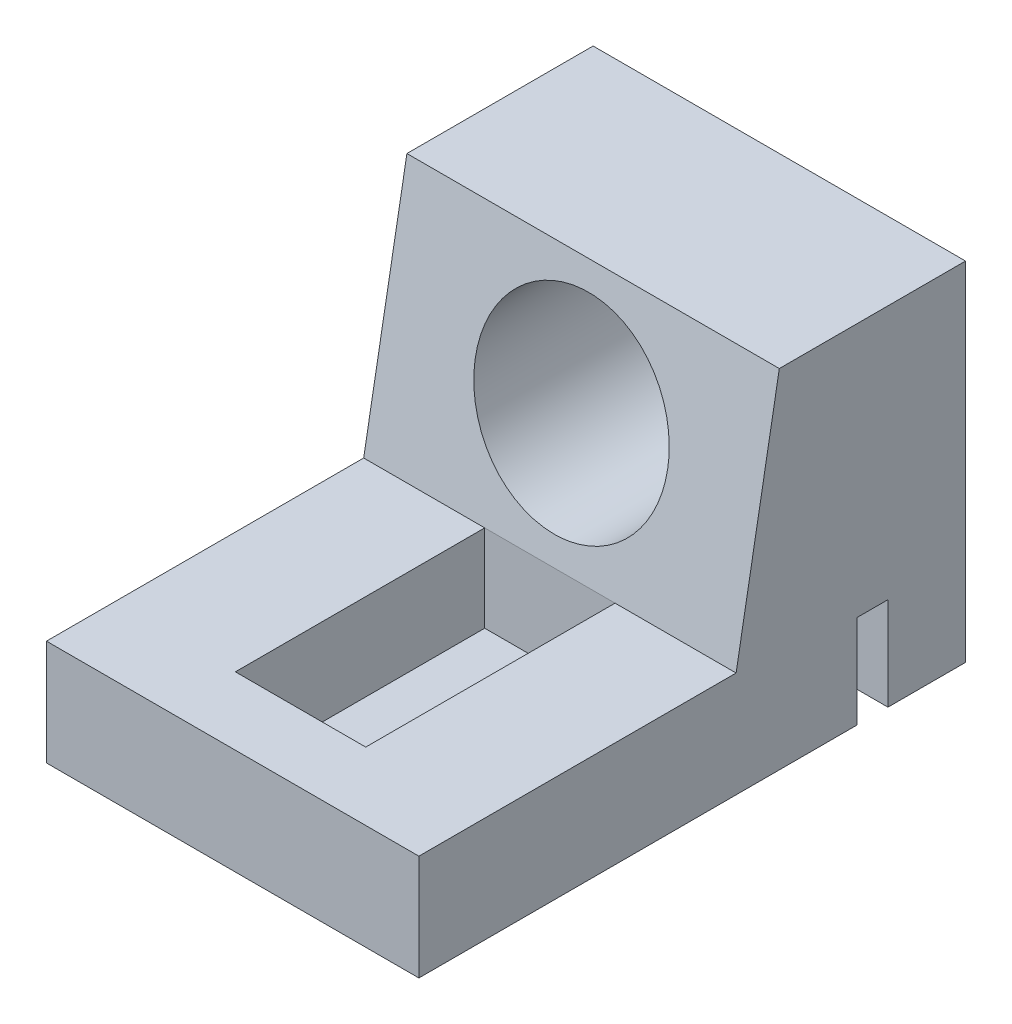
ISO-10303-21;
HEADER;
FILE_DESCRIPTION(('STEP AP214'),'2;1');
FILE_NAME('part.step','',(''),(''),'','','');
FILE_SCHEMA(('AUTOMOTIVE_DESIGN { 1 0 10303 214 1 1 1 1 }'));
ENDSEC;
DATA;
#1=APPLICATION_CONTEXT('core data for automotive mechanical design processes');
#2=APPLICATION_PROTOCOL_DEFINITION('international standard','automotive_design',2000,#1);
#3=PRODUCT_CONTEXT('',#1,'mechanical');
#4=PRODUCT('Part','Part','',(#3));
#5=PRODUCT_RELATED_PRODUCT_CATEGORY('part','',(#4));
#6=PRODUCT_DEFINITION_FORMATION('','',#4);
#7=PRODUCT_DEFINITION_CONTEXT('part definition',#1,'design');
#8=PRODUCT_DEFINITION('design','',#6,#7);
#9=PRODUCT_DEFINITION_SHAPE('','',#8);
#10=(LENGTH_UNIT() NAMED_UNIT(*) SI_UNIT(.MILLI.,.METRE.));
#11=(NAMED_UNIT(*) PLANE_ANGLE_UNIT() SI_UNIT($,.RADIAN.));
#12=(NAMED_UNIT(*) SI_UNIT($,.STERADIAN.) SOLID_ANGLE_UNIT());
#13=UNCERTAINTY_MEASURE_WITH_UNIT(LENGTH_MEASURE(1.E-05),#10,'distance_accuracy_value','');
#14=(GEOMETRIC_REPRESENTATION_CONTEXT(3) GLOBAL_UNCERTAINTY_ASSIGNED_CONTEXT((#13)) GLOBAL_UNIT_ASSIGNED_CONTEXT((#10,
#11,#12)) REPRESENTATION_CONTEXT('',''));
#15=CARTESIAN_POINT('',(0.,0.,0.));
#16=DIRECTION('',(0.,0.,1.));
#17=DIRECTION('',(1.,0.,0.));
#18=AXIS2_PLACEMENT_3D('',#15,#16,#17);
#19=CARTESIAN_POINT('',(0.,-34.454396412768,0.));
#20=DIRECTION('',(0.,-1.,0.));
#21=DIRECTION('',(0.,0.,-1.));
#22=AXIS2_PLACEMENT_3D('',#19,#20,#21);
#23=PLANE('',#22);
#24=DIRECTION('',(0.,0.,-1.));
#25=VECTOR('',#24,1.);
#26=CARTESIAN_POINT('',(0.,-34.454396412768,4.57508133052897));
#27=LINE('',#26,#25);
#28=CARTESIAN_POINT('',(0.,-34.454396412768,73.0702333101134));
#29=VERTEX_POINT('',#28);
#30=CARTESIAN_POINT('',(0.,-34.454396412768,21.9642857142857));
#31=VERTEX_POINT('',#30);
#32=EDGE_CURVE('E186',#29,#31,#27,.T.);
#33=ORIENTED_EDGE('',*,*,#32,.F.);
#34=DIRECTION('',(1.,0.,0.));
#35=VECTOR('',#34,1.);
#36=CARTESIAN_POINT('',(0.,-34.454396412768,73.0702333101134));
#37=LINE('',#36,#35);
#38=CARTESIAN_POINT('',(60.,-34.454396412768,73.0702333101134));
#39=VERTEX_POINT('',#38);
#40=EDGE_CURVE('E51',#29,#39,#37,.T.);
#41=ORIENTED_EDGE('',*,*,#40,.T.);
#42=DIRECTION('',(0.,0.,1.));
#43=VECTOR('',#42,1.);
#44=CARTESIAN_POINT('',(60.,-34.454396412768,4.57508133052897));
#45=LINE('',#44,#43);
#46=CARTESIAN_POINT('',(60.,-34.454396412768,21.9642857142857));
#47=VERTEX_POINT('',#46);
#48=EDGE_CURVE('E198',#47,#39,#45,.T.);
#49=ORIENTED_EDGE('',*,*,#48,.F.);
#50=DIRECTION('',(-1.,0.,0.));
#51=VECTOR('',#50,1.);
#52=CARTESIAN_POINT('',(60.,-34.454396412768,21.9642857142857));
#53=LINE('',#52,#51);
#54=CARTESIAN_POINT('',(40.5,-34.454396412768,21.9642857142857));
#55=VERTEX_POINT('',#54);
#56=EDGE_CURVE('E11',#47,#55,#53,.T.);
#57=ORIENTED_EDGE('',*,*,#56,.T.);
#58=DIRECTION('',(0.,0.,1.));
#59=VECTOR('',#58,1.);
#60=CARTESIAN_POINT('',(40.5,-34.454396412768,0.));
#61=LINE('',#60,#59);
#62=CARTESIAN_POINT('',(40.5,-34.454396412768,62.1342857142857));
#63=VERTEX_POINT('',#62);
#64=EDGE_CURVE('E59',#55,#63,#61,.T.);
#65=ORIENTED_EDGE('',*,*,#64,.T.);
#66=DIRECTION('',(-1.,0.,0.));
#67=VECTOR('',#66,1.);
#68=CARTESIAN_POINT('',(0.,-34.454396412768,62.1342857142857));
#69=LINE('',#68,#67);
#70=CARTESIAN_POINT('',(19.5,-34.454396412768,62.1342857142857));
#71=VERTEX_POINT('',#70);
#72=EDGE_CURVE('E442',#63,#71,#69,.T.);
#73=ORIENTED_EDGE('',*,*,#72,.T.);
#74=DIRECTION('',(0.,0.,-1.));
#75=VECTOR('',#74,1.);
#76=CARTESIAN_POINT('',(19.5,-34.454396412768,0.));
#77=LINE('',#76,#75);
#78=CARTESIAN_POINT('',(19.5,-34.454396412768,21.9642857142857));
#79=VERTEX_POINT('',#78);
#80=EDGE_CURVE('E189',#71,#79,#77,.T.);
#81=ORIENTED_EDGE('',*,*,#80,.T.);
#82=EDGE_CURVE('E44',#79,#31,#53,.T.);
#83=ORIENTED_EDGE('',*,*,#82,.T.);
#84=EDGE_LOOP('',(#33,#41,#49,#57,#65,#73,#81,#83));
#85=FACE_BOUND('',#84,.T.);
#86=ADVANCED_FACE('F35',(#85),#23,.F.);
#87=CARTESIAN_POINT('',(60.,4.545603587232,15.));
#88=DIRECTION('',(0.,-0.175790638483658,-0.984427575508482));
#89=DIRECTION('',(0.,0.984427575508482,-0.175790638483658));
#90=AXIS2_PLACEMENT_3D('',#87,#88,#89);
#91=PLANE('',#90);
#92=CARTESIAN_POINT('',(30.,-14.954396412768,18.4821428571429));
#93=DIRECTION('',(0.,-0.175790638483658,-0.984427575508482));
#94=DIRECTION('',(0.,-0.984427575508482,0.175790638483658));
#95=AXIS2_PLACEMENT_3D('',#92,#93,#94);
#96=ELLIPSE('',#95,15.7451907947559,15.5);
#97=CARTESIAN_POINT('',(30.,-30.454396412768,21.25));
#98=VERTEX_POINT('',#97);
#99=EDGE_CURVE('E167',#98,#98,#96,.T.);
#100=ORIENTED_EDGE('',*,*,#99,.T.);
#101=EDGE_LOOP('',(#100));
#102=FACE_BOUND('',#101,.T.);
#103=ORIENTED_EDGE('',*,*,#56,.F.);
#104=DIRECTION('',(0.,-0.984427575508482,0.175790638483658));
#105=VECTOR('',#104,1.);
#106=CARTESIAN_POINT('',(60.,4.545603587232,15.));
#107=LINE('',#106,#105);
#108=CARTESIAN_POINT('',(60.,4.545603587232,15.));
#109=VERTEX_POINT('',#108);
#110=EDGE_CURVE('E172',#109,#47,#107,.T.);
#111=ORIENTED_EDGE('',*,*,#110,.F.);
#112=DIRECTION('',(-1.,0.,0.));
#113=VECTOR('',#112,1.);
#114=CARTESIAN_POINT('',(60.,4.545603587232,15.));
#115=LINE('',#114,#113);
#116=CARTESIAN_POINT('',(0.,4.545603587232,15.));
#117=VERTEX_POINT('',#116);
#118=EDGE_CURVE('E173',#109,#117,#115,.T.);
#119=ORIENTED_EDGE('',*,*,#118,.T.);
#120=DIRECTION('',(0.,-0.984427575508482,0.175790638483658));
#121=VECTOR('',#120,1.);
#122=CARTESIAN_POINT('',(0.,4.545603587232,15.));
#123=LINE('',#122,#121);
#124=EDGE_CURVE('E164',#117,#31,#123,.T.);
#125=ORIENTED_EDGE('',*,*,#124,.T.);
#126=ORIENTED_EDGE('',*,*,#82,.F.);
#127=DIRECTION('',(1.,0.,0.));
#128=VECTOR('',#127,1.);
#129=CARTESIAN_POINT('',(0.,-34.454396412768,21.9642857142857));
#130=LINE('',#129,#128);
#131=EDGE_CURVE('E238',#79,#55,#130,.T.);
#132=ORIENTED_EDGE('',*,*,#131,.T.);
#133=EDGE_LOOP('',(#103,#111,#119,#125,#126,#132));
#134=FACE_BOUND('',#133,.T.);
#135=ADVANCED_FACE('F37',(#102,#134),#91,.F.);
#136=CARTESIAN_POINT('',(60.,-51.454396412768,25.));
#137=DIRECTION('',(0.,1.,0.));
#138=DIRECTION('',(0.,0.,1.));
#139=AXIS2_PLACEMENT_3D('',#136,#137,#138);
#140=PLANE('',#139);
#141=DIRECTION('',(0.,0.,-1.));
#142=VECTOR('',#141,1.);
#143=CARTESIAN_POINT('',(60.,-51.454396412768,25.));
#144=LINE('',#143,#142);
#145=CARTESIAN_POINT('',(60.,-51.454396412768,73.0702333101134));
#146=VERTEX_POINT('',#145);
#147=CARTESIAN_POINT('',(60.,-51.454396412768,2.5));
#148=VERTEX_POINT('',#147);
#149=EDGE_CURVE('E231',#146,#148,#144,.T.);
#150=ORIENTED_EDGE('',*,*,#149,.F.);
#151=DIRECTION('',(-1.,0.,0.));
#152=VECTOR('',#151,1.);
#153=CARTESIAN_POINT('',(60.,-51.454396412768,73.0702333101134));
#154=LINE('',#153,#152);
#155=CARTESIAN_POINT('',(0.,-51.454396412768,73.0702333101134));
#156=VERTEX_POINT('',#155);
#157=EDGE_CURVE('E243',#146,#156,#154,.T.);
#158=ORIENTED_EDGE('',*,*,#157,.T.);
#159=DIRECTION('',(0.,0.,-1.));
#160=VECTOR('',#159,1.);
#161=CARTESIAN_POINT('',(0.,-51.454396412768,25.));
#162=LINE('',#161,#160);
#163=CARTESIAN_POINT('',(0.,-51.454396412768,2.5));
#164=VERTEX_POINT('',#163);
#165=EDGE_CURVE('E163',#156,#164,#162,.T.);
#166=ORIENTED_EDGE('',*,*,#165,.T.);
#167=DIRECTION('',(-1.,0.,0.));
#168=VECTOR('',#167,1.);
#169=CARTESIAN_POINT('',(60.,-51.454396412768,2.5));
#170=LINE('',#169,#168);
#171=EDGE_CURVE('E223',#148,#164,#170,.T.);
#172=ORIENTED_EDGE('',*,*,#171,.F.);
#173=EDGE_LOOP('',(#150,#158,#166,#172));
#174=FACE_BOUND('',#173,.T.);
#175=ADVANCED_FACE('F248',(#174),#140,.F.);
#176=CARTESIAN_POINT('',(0.,-51.454396412768,-2.5));
#177=VERTEX_POINT('',#176);
#178=CARTESIAN_POINT('',(0.,-51.454396412768,-15.));
#179=VERTEX_POINT('',#178);
#180=EDGE_CURVE('E156',#177,#179,#162,.T.);
#181=ORIENTED_EDGE('',*,*,#180,.T.);
#182=DIRECTION('',(1.,0.,0.));
#183=VECTOR('',#182,1.);
#184=CARTESIAN_POINT('',(0.,-51.454396412768,-15.));
#185=LINE('',#184,#183);
#186=CARTESIAN_POINT('',(60.,-51.454396412768,-15.));
#187=VERTEX_POINT('',#186);
#188=EDGE_CURVE('E138',#179,#187,#185,.T.);
#189=ORIENTED_EDGE('',*,*,#188,.T.);
#190=CARTESIAN_POINT('',(60.,-51.454396412768,-2.5));
#191=VERTEX_POINT('',#190);
#192=EDGE_CURVE('E230',#191,#187,#144,.T.);
#193=ORIENTED_EDGE('',*,*,#192,.F.);
#194=DIRECTION('',(1.,0.,0.));
#195=VECTOR('',#194,1.);
#196=CARTESIAN_POINT('',(60.,-51.454396412768,-2.5));
#197=LINE('',#196,#195);
#198=EDGE_CURVE('E162',#177,#191,#197,.T.);
#199=ORIENTED_EDGE('',*,*,#198,.F.);
#200=EDGE_LOOP('',(#181,#189,#193,#199));
#201=FACE_BOUND('',#200,.T.);
#202=ADVANCED_FACE('F161',(#201),#140,.F.);
#203=CARTESIAN_POINT('',(60.,0.,0.));
#204=DIRECTION('',(1.,0.,0.));
#205=DIRECTION('',(0.,0.,-1.));
#206=AXIS2_PLACEMENT_3D('',#203,#204,#205);
#207=PLANE('',#206);
#208=DIRECTION('',(0.,1.,0.));
#209=VECTOR('',#208,1.);
#210=CARTESIAN_POINT('',(60.,4.545603587232,-15.));
#211=LINE('',#210,#209);
#212=CARTESIAN_POINT('',(60.,4.545603587232,-15.));
#213=VERTEX_POINT('',#212);
#214=EDGE_CURVE('E145',#187,#213,#211,.T.);
#215=ORIENTED_EDGE('',*,*,#214,.T.);
#216=DIRECTION('',(0.,0.,1.));
#217=VECTOR('',#216,1.);
#218=CARTESIAN_POINT('',(60.,4.545603587232,15.));
#219=LINE('',#218,#217);
#220=EDGE_CURVE('E177',#213,#109,#219,.T.);
#221=ORIENTED_EDGE('',*,*,#220,.T.);
#222=ORIENTED_EDGE('',*,*,#110,.T.);
#223=ORIENTED_EDGE('',*,*,#48,.T.);
#224=DIRECTION('',(0.,1.,0.));
#225=VECTOR('',#224,1.);
#226=CARTESIAN_POINT('',(60.,-51.454396412768,73.0702333101134));
#227=LINE('',#226,#225);
#228=EDGE_CURVE('E240',#146,#39,#227,.T.);
#229=ORIENTED_EDGE('',*,*,#228,.F.);
#230=ORIENTED_EDGE('',*,*,#149,.T.);
#231=DIRECTION('',(0.,-1.,0.));
#232=VECTOR('',#231,1.);
#233=CARTESIAN_POINT('',(60.,-66.454396412768,2.5));
#234=LINE('',#233,#232);
#235=CARTESIAN_POINT('',(60.,-36.454396412768,2.5));
#236=VERTEX_POINT('',#235);
#237=EDGE_CURVE('E208',#236,#148,#234,.T.);
#238=ORIENTED_EDGE('',*,*,#237,.F.);
#239=DIRECTION('',(0.,0.,1.));
#240=VECTOR('',#239,1.);
#241=CARTESIAN_POINT('',(60.,-36.454396412768,-2.5));
#242=LINE('',#241,#240);
#243=CARTESIAN_POINT('',(60.,-36.454396412768,-2.5));
#244=VERTEX_POINT('',#243);
#245=EDGE_CURVE('E213',#244,#236,#242,.T.);
#246=ORIENTED_EDGE('',*,*,#245,.F.);
#247=DIRECTION('',(0.,1.,0.));
#248=VECTOR('',#247,1.);
#249=CARTESIAN_POINT('',(60.,-66.454396412768,-2.5));
#250=LINE('',#249,#248);
#251=EDGE_CURVE('E211',#191,#244,#250,.T.);
#252=ORIENTED_EDGE('',*,*,#251,.F.);
#253=ORIENTED_EDGE('',*,*,#192,.T.);
#254=EDGE_LOOP('',(#215,#221,#222,#223,#229,#230,#238,#246,#252,#253));
#255=FACE_BOUND('',#254,.T.);
#256=ADVANCED_FACE('F234',(#255),#207,.T.);
#257=CARTESIAN_POINT('',(0.,0.,0.));
#258=DIRECTION('',(1.,0.,0.));
#259=DIRECTION('',(0.,0.,-1.));
#260=AXIS2_PLACEMENT_3D('',#257,#258,#259);
#261=PLANE('',#260);
#262=DIRECTION('',(0.,0.,1.));
#263=VECTOR('',#262,1.);
#264=CARTESIAN_POINT('',(0.,4.545603587232,15.));
#265=LINE('',#264,#263);
#266=CARTESIAN_POINT('',(0.,4.54560358723201,-15.));
#267=VERTEX_POINT('',#266);
#268=EDGE_CURVE('E158',#267,#117,#265,.T.);
#269=ORIENTED_EDGE('',*,*,#268,.F.);
#270=DIRECTION('',(0.,-1.,0.));
#271=VECTOR('',#270,1.);
#272=CARTESIAN_POINT('',(0.,4.545603587232,-15.));
#273=LINE('',#272,#271);
#274=EDGE_CURVE('E142',#267,#179,#273,.T.);
#275=ORIENTED_EDGE('',*,*,#274,.T.);
#276=ORIENTED_EDGE('',*,*,#180,.F.);
#277=DIRECTION('',(0.,-1.,0.));
#278=VECTOR('',#277,1.);
#279=CARTESIAN_POINT('',(0.,0.,-2.5));
#280=LINE('',#279,#278);
#281=CARTESIAN_POINT('',(0.,-36.454396412768,-2.5));
#282=VERTEX_POINT('',#281);
#283=EDGE_CURVE('E179',#282,#177,#280,.T.);
#284=ORIENTED_EDGE('',*,*,#283,.F.);
#285=DIRECTION('',(0.,0.,1.));
#286=VECTOR('',#285,1.);
#287=CARTESIAN_POINT('',(0.,-36.454396412768,-2.5));
#288=LINE('',#287,#286);
#289=CARTESIAN_POINT('',(0.,-36.454396412768,2.5));
#290=VERTEX_POINT('',#289);
#291=EDGE_CURVE('E201',#282,#290,#288,.T.);
#292=ORIENTED_EDGE('',*,*,#291,.T.);
#293=DIRECTION('',(0.,-1.,0.));
#294=VECTOR('',#293,1.);
#295=CARTESIAN_POINT('',(0.,-66.454396412768,2.5));
#296=LINE('',#295,#294);
#297=EDGE_CURVE('E197',#290,#164,#296,.T.);
#298=ORIENTED_EDGE('',*,*,#297,.T.);
#299=ORIENTED_EDGE('',*,*,#165,.F.);
#300=DIRECTION('',(0.,1.,0.));
#301=VECTOR('',#300,1.);
#302=CARTESIAN_POINT('',(0.,-51.454396412768,73.0702333101134));
#303=LINE('',#302,#301);
#304=EDGE_CURVE('E196',#156,#29,#303,.T.);
#305=ORIENTED_EDGE('',*,*,#304,.T.);
#306=ORIENTED_EDGE('',*,*,#32,.T.);
#307=ORIENTED_EDGE('',*,*,#124,.F.);
#308=EDGE_LOOP('',(#269,#275,#276,#284,#292,#298,#299,#305,#306,#307));
#309=FACE_BOUND('',#308,.T.);
#310=ADVANCED_FACE('F154',(#309),#261,.F.);
#311=CARTESIAN_POINT('',(60.,4.545603587232,15.));
#312=DIRECTION('',(0.,-1.,0.));
#313=DIRECTION('',(0.,0.,-1.));
#314=AXIS2_PLACEMENT_3D('',#311,#312,#313);
#315=PLANE('',#314);
#316=ORIENTED_EDGE('',*,*,#268,.T.);
#317=ORIENTED_EDGE('',*,*,#118,.F.);
#318=ORIENTED_EDGE('',*,*,#220,.F.);
#319=DIRECTION('',(-1.,0.,0.));
#320=VECTOR('',#319,1.);
#321=CARTESIAN_POINT('',(60.,4.54560358723201,-15.));
#322=LINE('',#321,#320);
#323=EDGE_CURVE('E176',#213,#267,#322,.T.);
#324=ORIENTED_EDGE('',*,*,#323,.T.);
#325=EDGE_LOOP('',(#316,#317,#318,#324));
#326=FACE_BOUND('',#325,.T.);
#327=ADVANCED_FACE('F236',(#326),#315,.F.);
#328=CARTESIAN_POINT('',(30.,-14.954396412768,-29.));
#329=DIRECTION('',(0.,0.,1.));
#330=DIRECTION('',(1.,0.,0.));
#331=AXIS2_PLACEMENT_3D('',#328,#329,#330);
#332=CYLINDRICAL_SURFACE('',#331,15.5);
#333=CARTESIAN_POINT('',(30.,-14.954396412768,-15.));
#334=DIRECTION('',(0.,0.,1.));
#335=DIRECTION('',(1.,0.,0.));
#336=AXIS2_PLACEMENT_3D('',#333,#334,#335);
#337=CIRCLE('',#336,15.5);
#338=CARTESIAN_POINT('',(45.5,-14.954396412768,-15.));
#339=VERTEX_POINT('',#338);
#340=EDGE_CURVE('E39',#339,#339,#337,.F.);
#341=ORIENTED_EDGE('',*,*,#340,.T.);
#342=EDGE_LOOP('',(#341));
#343=FACE_BOUND('',#342,.T.);
#344=ORIENTED_EDGE('',*,*,#99,.F.);
#345=EDGE_LOOP('',(#344));
#346=FACE_BOUND('',#345,.T.);
#347=ADVANCED_FACE('F267',(#343,#346),#332,.F.);
#348=CARTESIAN_POINT('',(60.,-66.454396412768,2.5));
#349=DIRECTION('',(0.,0.,-1.));
#350=DIRECTION('',(-1.,0.,0.));
#351=AXIS2_PLACEMENT_3D('',#348,#349,#350);
#352=PLANE('',#351);
#353=ORIENTED_EDGE('',*,*,#171,.T.);
#354=ORIENTED_EDGE('',*,*,#297,.F.);
#355=DIRECTION('',(-1.,0.,0.));
#356=VECTOR('',#355,1.);
#357=CARTESIAN_POINT('',(60.,-36.454396412768,2.5));
#358=LINE('',#357,#356);
#359=EDGE_CURVE('E214',#236,#290,#358,.T.);
#360=ORIENTED_EDGE('',*,*,#359,.F.);
#361=ORIENTED_EDGE('',*,*,#237,.T.);
#362=EDGE_LOOP('',(#353,#354,#360,#361));
#363=FACE_BOUND('',#362,.T.);
#364=ADVANCED_FACE('F250',(#363),#352,.T.);
#365=CARTESIAN_POINT('',(60.,-66.454396412768,-2.5));
#366=DIRECTION('',(0.,0.,1.));
#367=DIRECTION('',(1.,0.,0.));
#368=AXIS2_PLACEMENT_3D('',#365,#366,#367);
#369=PLANE('',#368);
#370=ORIENTED_EDGE('',*,*,#198,.T.);
#371=ORIENTED_EDGE('',*,*,#251,.T.);
#372=DIRECTION('',(-1.,0.,0.));
#373=VECTOR('',#372,1.);
#374=CARTESIAN_POINT('',(60.,-36.454396412768,-2.5));
#375=LINE('',#374,#373);
#376=EDGE_CURVE('E220',#244,#282,#375,.T.);
#377=ORIENTED_EDGE('',*,*,#376,.T.);
#378=ORIENTED_EDGE('',*,*,#283,.T.);
#379=EDGE_LOOP('',(#370,#371,#377,#378));
#380=FACE_BOUND('',#379,.T.);
#381=ADVANCED_FACE('F258',(#380),#369,.T.);
#382=CARTESIAN_POINT('',(60.,-36.454396412768,-2.5));
#383=DIRECTION('',(0.,-1.,0.));
#384=DIRECTION('',(0.,0.,-1.));
#385=AXIS2_PLACEMENT_3D('',#382,#383,#384);
#386=PLANE('',#385);
#387=ORIENTED_EDGE('',*,*,#291,.F.);
#388=ORIENTED_EDGE('',*,*,#376,.F.);
#389=ORIENTED_EDGE('',*,*,#245,.T.);
#390=ORIENTED_EDGE('',*,*,#359,.T.);
#391=EDGE_LOOP('',(#387,#388,#389,#390));
#392=FACE_BOUND('',#391,.T.);
#393=ADVANCED_FACE('F255',(#392),#386,.T.);
#394=CARTESIAN_POINT('',(40.5,-48.454396412768,0.));
#395=DIRECTION('',(-1.,0.,0.));
#396=DIRECTION('',(0.,0.,1.));
#397=AXIS2_PLACEMENT_3D('',#394,#395,#396);
#398=PLANE('',#397);
#399=ORIENTED_EDGE('',*,*,#64,.F.);
#400=DIRECTION('',(0.,1.,0.));
#401=VECTOR('',#400,1.);
#402=CARTESIAN_POINT('',(40.5,-48.454396412768,21.9642857142857));
#403=LINE('',#402,#401);
#404=CARTESIAN_POINT('',(40.5,-48.454396412768,21.9642857142857));
#405=VERTEX_POINT('',#404);
#406=EDGE_CURVE('E440',#405,#55,#403,.T.);
#407=ORIENTED_EDGE('',*,*,#406,.F.);
#408=DIRECTION('',(0.,0.,1.));
#409=VECTOR('',#408,1.);
#410=CARTESIAN_POINT('',(40.5,-48.454396412768,0.));
#411=LINE('',#410,#409);
#412=CARTESIAN_POINT('',(40.5,-48.454396412768,62.1342857142857));
#413=VERTEX_POINT('',#412);
#414=EDGE_CURVE('E431',#405,#413,#411,.T.);
#415=ORIENTED_EDGE('',*,*,#414,.T.);
#416=DIRECTION('',(0.,1.,0.));
#417=VECTOR('',#416,1.);
#418=CARTESIAN_POINT('',(40.5,-48.454396412768,62.1342857142857));
#419=LINE('',#418,#417);
#420=EDGE_CURVE('E204',#413,#63,#419,.T.);
#421=ORIENTED_EDGE('',*,*,#420,.T.);
#422=EDGE_LOOP('',(#399,#407,#415,#421));
#423=FACE_BOUND('',#422,.T.);
#424=ADVANCED_FACE('F265',(#423),#398,.T.);
#425=CARTESIAN_POINT('',(0.,-48.454396412768,62.1342857142857));
#426=DIRECTION('',(0.,0.,-1.));
#427=DIRECTION('',(-1.,0.,0.));
#428=AXIS2_PLACEMENT_3D('',#425,#426,#427);
#429=PLANE('',#428);
#430=ORIENTED_EDGE('',*,*,#72,.F.);
#431=ORIENTED_EDGE('',*,*,#420,.F.);
#432=DIRECTION('',(-1.,0.,0.));
#433=VECTOR('',#432,1.);
#434=CARTESIAN_POINT('',(0.,-48.454396412768,62.1342857142857));
#435=LINE('',#434,#433);
#436=CARTESIAN_POINT('',(19.5,-48.454396412768,62.1342857142857));
#437=VERTEX_POINT('',#436);
#438=EDGE_CURVE('E434',#413,#437,#435,.T.);
#439=ORIENTED_EDGE('',*,*,#438,.T.);
#440=DIRECTION('',(0.,1.,0.));
#441=VECTOR('',#440,1.);
#442=CARTESIAN_POINT('',(19.5,-48.454396412768,62.1342857142857));
#443=LINE('',#442,#441);
#444=EDGE_CURVE('E449',#437,#71,#443,.T.);
#445=ORIENTED_EDGE('',*,*,#444,.T.);
#446=EDGE_LOOP('',(#430,#431,#439,#445));
#447=FACE_BOUND('',#446,.T.);
#448=ADVANCED_FACE('F278',(#447),#429,.T.);
#449=CARTESIAN_POINT('',(19.5,-48.454396412768,0.));
#450=DIRECTION('',(1.,0.,0.));
#451=DIRECTION('',(0.,0.,-1.));
#452=AXIS2_PLACEMENT_3D('',#449,#450,#451);
#453=PLANE('',#452);
#454=ORIENTED_EDGE('',*,*,#80,.F.);
#455=ORIENTED_EDGE('',*,*,#444,.F.);
#456=DIRECTION('',(0.,0.,-1.));
#457=VECTOR('',#456,1.);
#458=CARTESIAN_POINT('',(19.5,-48.454396412768,0.));
#459=LINE('',#458,#457);
#460=CARTESIAN_POINT('',(19.5,-48.454396412768,21.9642857142857));
#461=VERTEX_POINT('',#460);
#462=EDGE_CURVE('E436',#437,#461,#459,.T.);
#463=ORIENTED_EDGE('',*,*,#462,.T.);
#464=DIRECTION('',(0.,1.,0.));
#465=VECTOR('',#464,1.);
#466=CARTESIAN_POINT('',(19.5,-48.454396412768,21.9642857142857));
#467=LINE('',#466,#465);
#468=EDGE_CURVE('E447',#461,#79,#467,.T.);
#469=ORIENTED_EDGE('',*,*,#468,.T.);
#470=EDGE_LOOP('',(#454,#455,#463,#469));
#471=FACE_BOUND('',#470,.T.);
#472=ADVANCED_FACE('F281',(#471),#453,.T.);
#473=CARTESIAN_POINT('',(0.,-48.454396412768,21.9642857142857));
#474=DIRECTION('',(0.,0.,1.));
#475=DIRECTION('',(1.,0.,0.));
#476=AXIS2_PLACEMENT_3D('',#473,#474,#475);
#477=PLANE('',#476);
#478=ORIENTED_EDGE('',*,*,#131,.F.);
#479=ORIENTED_EDGE('',*,*,#468,.F.);
#480=DIRECTION('',(1.,0.,0.));
#481=VECTOR('',#480,1.);
#482=CARTESIAN_POINT('',(0.,-48.454396412768,21.9642857142857));
#483=LINE('',#482,#481);
#484=EDGE_CURVE('E438',#461,#405,#483,.T.);
#485=ORIENTED_EDGE('',*,*,#484,.T.);
#486=ORIENTED_EDGE('',*,*,#406,.T.);
#487=EDGE_LOOP('',(#478,#479,#485,#486));
#488=FACE_BOUND('',#487,.T.);
#489=ADVANCED_FACE('F285',(#488),#477,.T.);
#490=CARTESIAN_POINT('',(0.,-48.454396412768,0.));
#491=DIRECTION('',(0.,-1.,0.));
#492=DIRECTION('',(0.,0.,-1.));
#493=AXIS2_PLACEMENT_3D('',#490,#491,#492);
#494=PLANE('',#493);
#495=ORIENTED_EDGE('',*,*,#414,.F.);
#496=ORIENTED_EDGE('',*,*,#484,.F.);
#497=ORIENTED_EDGE('',*,*,#462,.F.);
#498=ORIENTED_EDGE('',*,*,#438,.F.);
#499=EDGE_LOOP('',(#495,#496,#497,#498));
#500=FACE_BOUND('',#499,.T.);
#501=ADVANCED_FACE('F289',(#500),#494,.F.);
#502=CARTESIAN_POINT('',(60.,-51.454396412768,73.0702333101134));
#503=DIRECTION('',(0.,0.,-1.));
#504=DIRECTION('',(-1.,0.,0.));
#505=AXIS2_PLACEMENT_3D('',#502,#503,#504);
#506=PLANE('',#505);
#507=ORIENTED_EDGE('',*,*,#304,.F.);
#508=ORIENTED_EDGE('',*,*,#157,.F.);
#509=ORIENTED_EDGE('',*,*,#228,.T.);
#510=ORIENTED_EDGE('',*,*,#40,.F.);
#511=EDGE_LOOP('',(#507,#508,#509,#510));
#512=FACE_BOUND('',#511,.T.);
#513=ADVANCED_FACE('F293',(#512),#506,.F.);
#514=CARTESIAN_POINT('',(0.,0.,-15.));
#515=DIRECTION('',(0.,0.,1.));
#516=DIRECTION('',(1.,0.,0.));
#517=AXIS2_PLACEMENT_3D('',#514,#515,#516);
#518=PLANE('',#517);
#519=ORIENTED_EDGE('',*,*,#274,.F.);
#520=ORIENTED_EDGE('',*,*,#323,.F.);
#521=ORIENTED_EDGE('',*,*,#214,.F.);
#522=ORIENTED_EDGE('',*,*,#188,.F.);
#523=EDGE_LOOP('',(#519,#520,#521,#522));
#524=FACE_BOUND('',#523,.T.);
#525=ORIENTED_EDGE('',*,*,#340,.F.);
#526=EDGE_LOOP('',(#525));
#527=FACE_BOUND('',#526,.T.);
#528=ADVANCED_FACE('F140',(#524,#527),#518,.F.);
#529=CLOSED_SHELL('',(#86,#135,#175,#202,#256,#310,#327,#347,#364,#381,#393,#424,#448,#472,#489,
#501,#513,#528));
#530=MANIFOLD_SOLID_BREP('B2',#529);
#531=ADVANCED_BREP_SHAPE_REPRESENTATION('',(#18,#530),#14);
#532=SHAPE_DEFINITION_REPRESENTATION(#9,#531);
ENDSEC;
END-ISO-10303-21;
